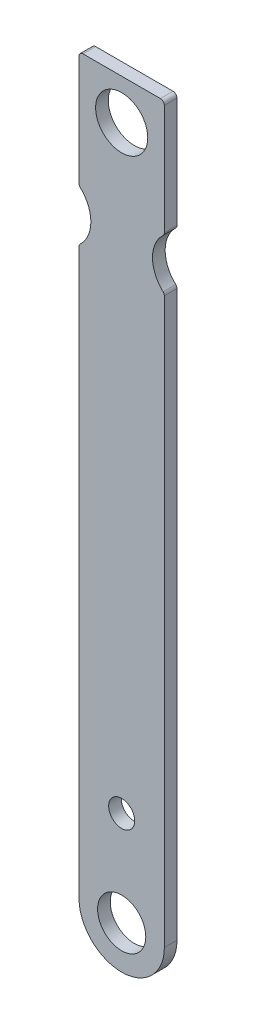
ISO-10303-21;
HEADER;
FILE_DESCRIPTION(('STEP AP214'),'2;1');
FILE_NAME('part.step','',(''),(''),'','','');
FILE_SCHEMA(('AUTOMOTIVE_DESIGN { 1 0 10303 214 1 1 1 1 }'));
ENDSEC;
DATA;
#1=APPLICATION_CONTEXT('core data for automotive mechanical design processes');
#2=APPLICATION_PROTOCOL_DEFINITION('international standard','automotive_design',2000,#1);
#3=PRODUCT_CONTEXT('',#1,'mechanical');
#4=PRODUCT('Part','Part','',(#3));
#5=PRODUCT_RELATED_PRODUCT_CATEGORY('part','',(#4));
#6=PRODUCT_DEFINITION_FORMATION('','',#4);
#7=PRODUCT_DEFINITION_CONTEXT('part definition',#1,'design');
#8=PRODUCT_DEFINITION('design','',#6,#7);
#9=PRODUCT_DEFINITION_SHAPE('','',#8);
#10=(LENGTH_UNIT() NAMED_UNIT(*) SI_UNIT(.MILLI.,.METRE.));
#11=(NAMED_UNIT(*) PLANE_ANGLE_UNIT() SI_UNIT($,.RADIAN.));
#12=(NAMED_UNIT(*) SI_UNIT($,.STERADIAN.) SOLID_ANGLE_UNIT());
#13=UNCERTAINTY_MEASURE_WITH_UNIT(LENGTH_MEASURE(1.E-05),#10,'distance_accuracy_value','');
#14=(GEOMETRIC_REPRESENTATION_CONTEXT(3) GLOBAL_UNCERTAINTY_ASSIGNED_CONTEXT((#13)) GLOBAL_UNIT_ASSIGNED_CONTEXT((#10,
#11,#12)) REPRESENTATION_CONTEXT('',''));
#15=CARTESIAN_POINT('',(0.,0.,0.));
#16=DIRECTION('',(0.,0.,1.));
#17=DIRECTION('',(1.,0.,0.));
#18=AXIS2_PLACEMENT_3D('',#15,#16,#17);
#19=CARTESIAN_POINT('',(2.44999999999965,46.1509999999993,0.8));
#20=DIRECTION('',(0.,0.,1.));
#21=DIRECTION('',(1.,0.,0.));
#22=AXIS2_PLACEMENT_3D('',#19,#20,#21);
#23=PLANE('',#22);
#24=CARTESIAN_POINT('',(0.,6.,0.8));
#25=DIRECTION('',(0.,0.,1.));
#26=DIRECTION('',(1.,0.,0.));
#27=AXIS2_PLACEMENT_3D('',#24,#25,#26);
#28=CIRCLE('',#27,0.825);
#29=CARTESIAN_POINT('',(0.824999999999999,6.,0.8));
#30=VERTEX_POINT('',#29);
#31=EDGE_CURVE('E312',#30,#30,#28,.T.);
#32=ORIENTED_EDGE('',*,*,#31,.F.);
#33=EDGE_LOOP('',(#32));
#34=FACE_BOUND('',#33,.T.);
#35=CARTESIAN_POINT('',(2.44999999999965,46.1509999999993,0.8));
#36=DIRECTION('',(0.,0.,1.));
#37=DIRECTION('',(1.,0.,0.));
#38=AXIS2_PLACEMENT_3D('',#35,#36,#37);
#39=CIRCLE('',#38,0.25);
#40=CARTESIAN_POINT('',(2.69999999999965,46.1509999999993,0.8));
#41=VERTEX_POINT('',#40);
#42=CARTESIAN_POINT('',(2.44999999999965,46.4009999999993,0.8));
#43=VERTEX_POINT('',#42);
#44=EDGE_CURVE('E193',#41,#43,#39,.T.);
#45=ORIENTED_EDGE('',*,*,#44,.T.);
#46=DIRECTION('',(-1.,0.,0.));
#47=VECTOR('',#46,1.);
#48=CARTESIAN_POINT('',(2.44999999999965,46.4009999999993,0.8));
#49=LINE('',#48,#47);
#50=CARTESIAN_POINT('',(-2.44999999999966,46.4009999999993,0.8));
#51=VERTEX_POINT('',#50);
#52=EDGE_CURVE('E111',#43,#51,#49,.T.);
#53=ORIENTED_EDGE('',*,*,#52,.T.);
#54=CARTESIAN_POINT('',(-2.44999999999966,46.1509999999993,0.8));
#55=DIRECTION('',(0.,0.,1.));
#56=DIRECTION('',(1.,0.,0.));
#57=AXIS2_PLACEMENT_3D('',#54,#55,#56);
#58=CIRCLE('',#57,0.25);
#59=CARTESIAN_POINT('',(-2.69999999999966,46.1509999999993,0.8));
#60=VERTEX_POINT('',#59);
#61=EDGE_CURVE('E226',#51,#60,#58,.T.);
#62=ORIENTED_EDGE('',*,*,#61,.T.);
#63=DIRECTION('',(0.,-1.,0.));
#64=VECTOR('',#63,1.);
#65=CARTESIAN_POINT('',(-2.69999999999966,46.1509999999993,0.8));
#66=LINE('',#65,#64);
#67=CARTESIAN_POINT('',(-2.69999999999966,39.1692811006002,0.8));
#68=VERTEX_POINT('',#67);
#69=EDGE_CURVE('E245',#60,#68,#66,.T.);
#70=ORIENTED_EDGE('',*,*,#69,.T.);
#71=CARTESIAN_POINT('',(-2.44999999999966,39.1692811006002,0.8));
#72=DIRECTION('',(0.,0.,1.));
#73=DIRECTION('',(1.,0.,0.));
#74=AXIS2_PLACEMENT_3D('',#71,#72,#73);
#75=CIRCLE('',#74,0.249999999999999);
#76=CARTESIAN_POINT('',(-2.62068527919258,38.9866160096089,0.8));
#77=VERTEX_POINT('',#76);
#78=EDGE_CURVE('E242',#68,#77,#75,.T.);
#79=ORIENTED_EDGE('',*,*,#78,.T.);
#80=CARTESIAN_POINT('',(-4.06400000015107,37.4420000000767,0.8));
#81=DIRECTION('',(0.,0.,-1.));
#82=DIRECTION('',(1.,0.,0.));
#83=AXIS2_PLACEMENT_3D('',#80,#81,#82);
#84=CIRCLE('',#83,2.11400000015105);
#85=CARTESIAN_POINT('',(-2.62068527919257,35.8973839905446,0.8));
#86=VERTEX_POINT('',#85);
#87=EDGE_CURVE('E244',#77,#86,#84,.T.);
#88=ORIENTED_EDGE('',*,*,#87,.T.);
#89=CARTESIAN_POINT('',(-2.44999999999965,35.7147188995533,0.8));
#90=DIRECTION('',(0.,0.,1.));
#91=DIRECTION('',(1.,0.,0.));
#92=AXIS2_PLACEMENT_3D('',#89,#90,#91);
#93=CIRCLE('',#92,0.250000000000003);
#94=CARTESIAN_POINT('',(-2.69999999999965,35.7147188995533,0.8));
#95=VERTEX_POINT('',#94);
#96=EDGE_CURVE('E247',#86,#95,#93,.T.);
#97=ORIENTED_EDGE('',*,*,#96,.T.);
#98=DIRECTION('',(0.,-1.,0.));
#99=VECTOR('',#98,1.);
#100=CARTESIAN_POINT('',(-2.69999999999965,35.7147188995533,0.8));
#101=LINE('',#100,#99);
#102=CARTESIAN_POINT('',(-2.69999999999966,0.,0.8));
#103=VERTEX_POINT('',#102);
#104=EDGE_CURVE('E253',#95,#103,#101,.T.);
#105=ORIENTED_EDGE('',*,*,#104,.T.);
#106=CARTESIAN_POINT('',(0.,0.,0.8));
#107=DIRECTION('',(0.,0.,1.));
#108=DIRECTION('',(1.,0.,0.));
#109=AXIS2_PLACEMENT_3D('',#106,#107,#108);
#110=CIRCLE('',#109,2.69999999999966);
#111=CARTESIAN_POINT('',(2.69999999999966,0.,0.8));
#112=VERTEX_POINT('',#111);
#113=EDGE_CURVE('E255',#103,#112,#110,.T.);
#114=ORIENTED_EDGE('',*,*,#113,.T.);
#115=DIRECTION('',(0.,1.,0.));
#116=VECTOR('',#115,1.);
#117=CARTESIAN_POINT('',(2.69999999999966,0.,0.8));
#118=LINE('',#117,#116);
#119=CARTESIAN_POINT('',(2.69999999999965,35.7147188995533,0.8));
#120=VERTEX_POINT('',#119);
#121=EDGE_CURVE('E257',#112,#120,#118,.T.);
#122=ORIENTED_EDGE('',*,*,#121,.T.);
#123=CARTESIAN_POINT('',(2.44999999999964,35.7147188995533,0.8));
#124=DIRECTION('',(0.,0.,1.));
#125=DIRECTION('',(1.,0.,0.));
#126=AXIS2_PLACEMENT_3D('',#123,#124,#125);
#127=CIRCLE('',#126,0.250000000000009);
#128=CARTESIAN_POINT('',(2.62068527919256,35.8973839905446,0.8));
#129=VERTEX_POINT('',#128);
#130=EDGE_CURVE('E148',#120,#129,#127,.T.);
#131=ORIENTED_EDGE('',*,*,#130,.T.);
#132=CARTESIAN_POINT('',(4.06400000015106,37.4420000000767,0.8));
#133=DIRECTION('',(0.,0.,-1.));
#134=DIRECTION('',(1.,0.,0.));
#135=AXIS2_PLACEMENT_3D('',#132,#133,#134);
#136=CIRCLE('',#135,2.11400000015105);
#137=CARTESIAN_POINT('',(2.62068527919257,38.9866160096089,0.8));
#138=VERTEX_POINT('',#137);
#139=EDGE_CURVE('E142',#129,#138,#136,.T.);
#140=ORIENTED_EDGE('',*,*,#139,.T.);
#141=CARTESIAN_POINT('',(2.44999999999965,39.1692811006002,0.8));
#142=DIRECTION('',(0.,0.,1.));
#143=DIRECTION('',(1.,0.,0.));
#144=AXIS2_PLACEMENT_3D('',#141,#142,#143);
#145=CIRCLE('',#144,0.249999999999998);
#146=CARTESIAN_POINT('',(2.69999999999965,39.1692811006002,0.8));
#147=VERTEX_POINT('',#146);
#148=EDGE_CURVE('E146',#138,#147,#145,.T.);
#149=ORIENTED_EDGE('',*,*,#148,.T.);
#150=DIRECTION('',(0.,1.,0.));
#151=VECTOR('',#150,1.);
#152=CARTESIAN_POINT('',(2.69999999999965,39.1692811006002,0.8));
#153=LINE('',#152,#151);
#154=EDGE_CURVE('E50',#147,#41,#153,.T.);
#155=ORIENTED_EDGE('',*,*,#154,.T.);
#156=EDGE_LOOP('',(#45,#53,#62,#70,#79,#88,#97,#105,#114,#122,#131,#140,#149,#155));
#157=FACE_BOUND('',#156,.T.);
#158=CARTESIAN_POINT('',(0.,0.,0.8));
#159=DIRECTION('',(0.,0.,1.));
#160=DIRECTION('',(1.,0.,0.));
#161=AXIS2_PLACEMENT_3D('',#158,#159,#160);
#162=CIRCLE('',#161,1.525);
#163=CARTESIAN_POINT('',(1.525,0.,0.8));
#164=VERTEX_POINT('',#163);
#165=EDGE_CURVE('E170',#164,#164,#162,.T.);
#166=ORIENTED_EDGE('',*,*,#165,.F.);
#167=EDGE_LOOP('',(#166));
#168=FACE_BOUND('',#167,.T.);
#169=CARTESIAN_POINT('',(0.,43.8509999999993,0.8));
#170=DIRECTION('',(0.,0.,1.));
#171=DIRECTION('',(1.,0.,0.));
#172=AXIS2_PLACEMENT_3D('',#169,#170,#171);
#173=CIRCLE('',#172,1.65);
#174=CARTESIAN_POINT('',(1.65,43.8509999999993,0.8));
#175=VERTEX_POINT('',#174);
#176=EDGE_CURVE('E303',#175,#175,#173,.T.);
#177=ORIENTED_EDGE('',*,*,#176,.F.);
#178=EDGE_LOOP('',(#177));
#179=FACE_BOUND('',#178,.T.);
#180=ADVANCED_FACE('F33',(#34,#157,#168,#179),#23,.T.);
#181=CARTESIAN_POINT('',(2.44999999999965,46.1509999999993,0.));
#182=DIRECTION('',(0.,0.,1.));
#183=DIRECTION('',(1.,0.,0.));
#184=AXIS2_PLACEMENT_3D('',#181,#182,#183);
#185=PLANE('',#184);
#186=CARTESIAN_POINT('',(2.44999999999965,46.1509999999993,0.));
#187=DIRECTION('',(0.,0.,1.));
#188=DIRECTION('',(1.,0.,0.));
#189=AXIS2_PLACEMENT_3D('',#186,#187,#188);
#190=CIRCLE('',#189,0.25);
#191=CARTESIAN_POINT('',(2.69999999999965,46.1509999999993,0.));
#192=VERTEX_POINT('',#191);
#193=CARTESIAN_POINT('',(2.44999999999965,46.4009999999993,0.));
#194=VERTEX_POINT('',#193);
#195=EDGE_CURVE('E166',#192,#194,#190,.T.);
#196=ORIENTED_EDGE('',*,*,#195,.F.);
#197=DIRECTION('',(0.,1.,0.));
#198=VECTOR('',#197,1.);
#199=CARTESIAN_POINT('',(2.69999999999965,39.1692811006002,0.));
#200=LINE('',#199,#198);
#201=CARTESIAN_POINT('',(2.69999999999965,39.1692811006002,0.));
#202=VERTEX_POINT('',#201);
#203=EDGE_CURVE('E103',#202,#192,#200,.T.);
#204=ORIENTED_EDGE('',*,*,#203,.F.);
#205=CARTESIAN_POINT('',(2.44999999999965,39.1692811006002,0.));
#206=DIRECTION('',(0.,0.,1.));
#207=DIRECTION('',(1.,0.,0.));
#208=AXIS2_PLACEMENT_3D('',#205,#206,#207);
#209=CIRCLE('',#208,0.249999999999998);
#210=CARTESIAN_POINT('',(2.62068527919257,38.9866160096089,0.));
#211=VERTEX_POINT('',#210);
#212=EDGE_CURVE('E97',#211,#202,#209,.T.);
#213=ORIENTED_EDGE('',*,*,#212,.F.);
#214=CARTESIAN_POINT('',(4.06400000015106,37.4420000000767,0.));
#215=DIRECTION('',(0.,0.,-1.));
#216=DIRECTION('',(1.,0.,0.));
#217=AXIS2_PLACEMENT_3D('',#214,#215,#216);
#218=CIRCLE('',#217,2.11400000015105);
#219=CARTESIAN_POINT('',(2.62068527919256,35.8973839905446,0.));
#220=VERTEX_POINT('',#219);
#221=EDGE_CURVE('E156',#220,#211,#218,.T.);
#222=ORIENTED_EDGE('',*,*,#221,.F.);
#223=CARTESIAN_POINT('',(2.44999999999964,35.7147188995533,0.));
#224=DIRECTION('',(0.,0.,1.));
#225=DIRECTION('',(1.,0.,0.));
#226=AXIS2_PLACEMENT_3D('',#223,#224,#225);
#227=CIRCLE('',#226,0.250000000000009);
#228=CARTESIAN_POINT('',(2.69999999999965,35.7147188995533,0.));
#229=VERTEX_POINT('',#228);
#230=EDGE_CURVE('E188',#229,#220,#227,.T.);
#231=ORIENTED_EDGE('',*,*,#230,.F.);
#232=DIRECTION('',(0.,1.,0.));
#233=VECTOR('',#232,1.);
#234=CARTESIAN_POINT('',(2.69999999999966,0.,0.));
#235=LINE('',#234,#233);
#236=CARTESIAN_POINT('',(2.69999999999966,0.,0.));
#237=VERTEX_POINT('',#236);
#238=EDGE_CURVE('E186',#237,#229,#235,.T.);
#239=ORIENTED_EDGE('',*,*,#238,.F.);
#240=CARTESIAN_POINT('',(0.,0.,0.));
#241=DIRECTION('',(0.,0.,1.));
#242=DIRECTION('',(1.,0.,0.));
#243=AXIS2_PLACEMENT_3D('',#240,#241,#242);
#244=CIRCLE('',#243,2.69999999999966);
#245=CARTESIAN_POINT('',(-2.69999999999966,0.,0.));
#246=VERTEX_POINT('',#245);
#247=EDGE_CURVE('E184',#246,#237,#244,.T.);
#248=ORIENTED_EDGE('',*,*,#247,.F.);
#249=DIRECTION('',(0.,-1.,0.));
#250=VECTOR('',#249,1.);
#251=CARTESIAN_POINT('',(-2.69999999999965,35.7147188995533,0.));
#252=LINE('',#251,#250);
#253=CARTESIAN_POINT('',(-2.69999999999965,35.7147188995533,0.));
#254=VERTEX_POINT('',#253);
#255=EDGE_CURVE('E182',#254,#246,#252,.T.);
#256=ORIENTED_EDGE('',*,*,#255,.F.);
#257=CARTESIAN_POINT('',(-2.44999999999965,35.7147188995533,0.));
#258=DIRECTION('',(0.,0.,1.));
#259=DIRECTION('',(1.,0.,0.));
#260=AXIS2_PLACEMENT_3D('',#257,#258,#259);
#261=CIRCLE('',#260,0.250000000000003);
#262=CARTESIAN_POINT('',(-2.62068527919257,35.8973839905446,0.));
#263=VERTEX_POINT('',#262);
#264=EDGE_CURVE('E180',#263,#254,#261,.T.);
#265=ORIENTED_EDGE('',*,*,#264,.F.);
#266=CARTESIAN_POINT('',(-4.06400000015107,37.4420000000767,0.));
#267=DIRECTION('',(0.,0.,-1.));
#268=DIRECTION('',(1.,0.,0.));
#269=AXIS2_PLACEMENT_3D('',#266,#267,#268);
#270=CIRCLE('',#269,2.11400000015105);
#271=CARTESIAN_POINT('',(-2.62068527919258,38.9866160096089,0.));
#272=VERTEX_POINT('',#271);
#273=EDGE_CURVE('E178',#272,#263,#270,.T.);
#274=ORIENTED_EDGE('',*,*,#273,.F.);
#275=CARTESIAN_POINT('',(-2.44999999999966,39.1692811006002,0.));
#276=DIRECTION('',(0.,0.,1.));
#277=DIRECTION('',(1.,0.,0.));
#278=AXIS2_PLACEMENT_3D('',#275,#276,#277);
#279=CIRCLE('',#278,0.249999999999999);
#280=CARTESIAN_POINT('',(-2.69999999999966,39.1692811006002,0.));
#281=VERTEX_POINT('',#280);
#282=EDGE_CURVE('E176',#281,#272,#279,.T.);
#283=ORIENTED_EDGE('',*,*,#282,.F.);
#284=DIRECTION('',(0.,-1.,0.));
#285=VECTOR('',#284,1.);
#286=CARTESIAN_POINT('',(-2.69999999999966,46.1509999999993,0.));
#287=LINE('',#286,#285);
#288=CARTESIAN_POINT('',(-2.69999999999966,46.1509999999993,0.));
#289=VERTEX_POINT('',#288);
#290=EDGE_CURVE('E174',#289,#281,#287,.T.);
#291=ORIENTED_EDGE('',*,*,#290,.F.);
#292=CARTESIAN_POINT('',(-2.44999999999966,46.1509999999993,0.));
#293=DIRECTION('',(0.,0.,1.));
#294=DIRECTION('',(1.,0.,0.));
#295=AXIS2_PLACEMENT_3D('',#292,#293,#294);
#296=CIRCLE('',#295,0.25);
#297=CARTESIAN_POINT('',(-2.44999999999966,46.4009999999993,0.));
#298=VERTEX_POINT('',#297);
#299=EDGE_CURVE('E172',#298,#289,#296,.T.);
#300=ORIENTED_EDGE('',*,*,#299,.F.);
#301=DIRECTION('',(-1.,0.,0.));
#302=VECTOR('',#301,1.);
#303=CARTESIAN_POINT('',(2.44999999999965,46.4009999999993,0.));
#304=LINE('',#303,#302);
#305=EDGE_CURVE('E169',#194,#298,#304,.T.);
#306=ORIENTED_EDGE('',*,*,#305,.F.);
#307=EDGE_LOOP('',(#196,#204,#213,#222,#231,#239,#248,#256,#265,#274,#283,#291,#300,#306));
#308=FACE_BOUND('',#307,.T.);
#309=CARTESIAN_POINT('',(0.,0.,0.));
#310=DIRECTION('',(0.,0.,1.));
#311=DIRECTION('',(1.,0.,0.));
#312=AXIS2_PLACEMENT_3D('',#309,#310,#311);
#313=CIRCLE('',#312,1.525);
#314=CARTESIAN_POINT('',(1.525,0.,0.));
#315=VERTEX_POINT('',#314);
#316=EDGE_CURVE('E315',#315,#315,#313,.T.);
#317=ORIENTED_EDGE('',*,*,#316,.T.);
#318=EDGE_LOOP('',(#317));
#319=FACE_BOUND('',#318,.T.);
#320=CARTESIAN_POINT('',(0.,6.,0.));
#321=DIRECTION('',(0.,0.,1.));
#322=DIRECTION('',(1.,0.,0.));
#323=AXIS2_PLACEMENT_3D('',#320,#321,#322);
#324=CIRCLE('',#323,0.825);
#325=CARTESIAN_POINT('',(0.824999999999999,6.,0.));
#326=VERTEX_POINT('',#325);
#327=EDGE_CURVE('E309',#326,#326,#324,.T.);
#328=ORIENTED_EDGE('',*,*,#327,.T.);
#329=EDGE_LOOP('',(#328));
#330=FACE_BOUND('',#329,.T.);
#331=CARTESIAN_POINT('',(0.,43.8509999999993,0.));
#332=DIRECTION('',(0.,0.,1.));
#333=DIRECTION('',(1.,0.,0.));
#334=AXIS2_PLACEMENT_3D('',#331,#332,#333);
#335=CIRCLE('',#334,1.65);
#336=CARTESIAN_POINT('',(1.65,43.8509999999993,0.));
#337=VERTEX_POINT('',#336);
#338=EDGE_CURVE('E306',#337,#337,#335,.T.);
#339=ORIENTED_EDGE('',*,*,#338,.T.);
#340=EDGE_LOOP('',(#339));
#341=FACE_BOUND('',#340,.T.);
#342=ADVANCED_FACE('F230',(#308,#319,#330,#341),#185,.F.);
#343=CARTESIAN_POINT('',(2.44999999999965,46.1509999999993,0.8));
#344=DIRECTION('',(0.,0.,-1.));
#345=DIRECTION('',(-1.,0.,0.));
#346=AXIS2_PLACEMENT_3D('',#343,#344,#345);
#347=CYLINDRICAL_SURFACE('',#346,0.25);
#348=ORIENTED_EDGE('',*,*,#195,.T.);
#349=DIRECTION('',(0.,0.,-1.));
#350=VECTOR('',#349,1.);
#351=CARTESIAN_POINT('',(2.44999999999965,46.4009999999993,0.8));
#352=LINE('',#351,#350);
#353=EDGE_CURVE('E11',#43,#194,#352,.T.);
#354=ORIENTED_EDGE('',*,*,#353,.F.);
#355=ORIENTED_EDGE('',*,*,#44,.F.);
#356=DIRECTION('',(0.,0.,-1.));
#357=VECTOR('',#356,1.);
#358=CARTESIAN_POINT('',(2.69999999999965,46.1509999999993,0.8));
#359=LINE('',#358,#357);
#360=EDGE_CURVE('E162',#41,#192,#359,.T.);
#361=ORIENTED_EDGE('',*,*,#360,.T.);
#362=EDGE_LOOP('',(#348,#354,#355,#361));
#363=FACE_BOUND('',#362,.T.);
#364=ADVANCED_FACE('F35',(#363),#347,.T.);
#365=CARTESIAN_POINT('',(2.44999999999965,46.4009999999993,0.8));
#366=DIRECTION('',(0.,-1.,0.));
#367=DIRECTION('',(0.,0.,-1.));
#368=AXIS2_PLACEMENT_3D('',#365,#366,#367);
#369=PLANE('',#368);
#370=ORIENTED_EDGE('',*,*,#305,.T.);
#371=DIRECTION('',(0.,0.,-1.));
#372=VECTOR('',#371,1.);
#373=CARTESIAN_POINT('',(-2.44999999999966,46.4009999999993,0.8));
#374=LINE('',#373,#372);
#375=EDGE_CURVE('E42',#51,#298,#374,.T.);
#376=ORIENTED_EDGE('',*,*,#375,.F.);
#377=ORIENTED_EDGE('',*,*,#52,.F.);
#378=ORIENTED_EDGE('',*,*,#353,.T.);
#379=EDGE_LOOP('',(#370,#376,#377,#378));
#380=FACE_BOUND('',#379,.T.);
#381=ADVANCED_FACE('F437',(#380),#369,.F.);
#382=CARTESIAN_POINT('',(-2.44999999999966,46.1509999999993,0.8));
#383=DIRECTION('',(0.,0.,-1.));
#384=DIRECTION('',(-1.,0.,0.));
#385=AXIS2_PLACEMENT_3D('',#382,#383,#384);
#386=CYLINDRICAL_SURFACE('',#385,0.25);
#387=ORIENTED_EDGE('',*,*,#299,.T.);
#388=DIRECTION('',(0.,0.,-1.));
#389=VECTOR('',#388,1.);
#390=CARTESIAN_POINT('',(-2.69999999999966,46.1509999999993,0.8));
#391=LINE('',#390,#389);
#392=EDGE_CURVE('E218',#60,#289,#391,.T.);
#393=ORIENTED_EDGE('',*,*,#392,.F.);
#394=ORIENTED_EDGE('',*,*,#61,.F.);
#395=ORIENTED_EDGE('',*,*,#375,.T.);
#396=EDGE_LOOP('',(#387,#393,#394,#395));
#397=FACE_BOUND('',#396,.T.);
#398=ADVANCED_FACE('F224',(#397),#386,.T.);
#399=CARTESIAN_POINT('',(-2.69999999999966,46.1509999999993,0.8));
#400=DIRECTION('',(1.,0.,0.));
#401=DIRECTION('',(0.,0.,-1.));
#402=AXIS2_PLACEMENT_3D('',#399,#400,#401);
#403=PLANE('',#402);
#404=ORIENTED_EDGE('',*,*,#290,.T.);
#405=DIRECTION('',(0.,0.,-1.));
#406=VECTOR('',#405,1.);
#407=CARTESIAN_POINT('',(-2.69999999999966,39.1692811006002,0.8));
#408=LINE('',#407,#406);
#409=EDGE_CURVE('E215',#68,#281,#408,.T.);
#410=ORIENTED_EDGE('',*,*,#409,.F.);
#411=ORIENTED_EDGE('',*,*,#69,.F.);
#412=ORIENTED_EDGE('',*,*,#392,.T.);
#413=EDGE_LOOP('',(#404,#410,#411,#412));
#414=FACE_BOUND('',#413,.T.);
#415=ADVANCED_FACE('F236',(#414),#403,.F.);
#416=CARTESIAN_POINT('',(-2.44999999999966,39.1692811006002,0.8));
#417=DIRECTION('',(0.,0.,-1.));
#418=DIRECTION('',(-1.,0.,0.));
#419=AXIS2_PLACEMENT_3D('',#416,#417,#418);
#420=CYLINDRICAL_SURFACE('',#419,0.249999999999999);
#421=ORIENTED_EDGE('',*,*,#282,.T.);
#422=DIRECTION('',(0.,0.,-1.));
#423=VECTOR('',#422,1.);
#424=CARTESIAN_POINT('',(-2.62068527919258,38.9866160096089,0.8));
#425=LINE('',#424,#423);
#426=EDGE_CURVE('E212',#77,#272,#425,.T.);
#427=ORIENTED_EDGE('',*,*,#426,.F.);
#428=ORIENTED_EDGE('',*,*,#78,.F.);
#429=ORIENTED_EDGE('',*,*,#409,.T.);
#430=EDGE_LOOP('',(#421,#427,#428,#429));
#431=FACE_BOUND('',#430,.T.);
#432=ADVANCED_FACE('F240',(#431),#420,.T.);
#433=CARTESIAN_POINT('',(-4.06400000015107,37.4420000000767,0.8));
#434=DIRECTION('',(0.,0.,-1.));
#435=DIRECTION('',(-1.,0.,0.));
#436=AXIS2_PLACEMENT_3D('',#433,#434,#435);
#437=CYLINDRICAL_SURFACE('',#436,2.11400000015105);
#438=ORIENTED_EDGE('',*,*,#273,.T.);
#439=DIRECTION('',(0.,0.,-1.));
#440=VECTOR('',#439,1.);
#441=CARTESIAN_POINT('',(-2.62068527919257,35.8973839905446,0.8));
#442=LINE('',#441,#440);
#443=EDGE_CURVE('E209',#86,#263,#442,.T.);
#444=ORIENTED_EDGE('',*,*,#443,.F.);
#445=ORIENTED_EDGE('',*,*,#87,.F.);
#446=ORIENTED_EDGE('',*,*,#426,.T.);
#447=EDGE_LOOP('',(#438,#444,#445,#446));
#448=FACE_BOUND('',#447,.T.);
#449=ADVANCED_FACE('F402',(#448),#437,.F.);
#450=CARTESIAN_POINT('',(-2.44999999999965,35.7147188995533,0.8));
#451=DIRECTION('',(0.,0.,-1.));
#452=DIRECTION('',(-1.,0.,0.));
#453=AXIS2_PLACEMENT_3D('',#450,#451,#452);
#454=CYLINDRICAL_SURFACE('',#453,0.250000000000003);
#455=ORIENTED_EDGE('',*,*,#264,.T.);
#456=DIRECTION('',(0.,0.,-1.));
#457=VECTOR('',#456,1.);
#458=CARTESIAN_POINT('',(-2.69999999999965,35.7147188995533,0.8));
#459=LINE('',#458,#457);
#460=EDGE_CURVE('E206',#95,#254,#459,.T.);
#461=ORIENTED_EDGE('',*,*,#460,.F.);
#462=ORIENTED_EDGE('',*,*,#96,.F.);
#463=ORIENTED_EDGE('',*,*,#443,.T.);
#464=EDGE_LOOP('',(#455,#461,#462,#463));
#465=FACE_BOUND('',#464,.T.);
#466=ADVANCED_FACE('F392',(#465),#454,.T.);
#467=CARTESIAN_POINT('',(-2.69999999999965,35.7147188995533,0.8));
#468=DIRECTION('',(1.,0.,0.));
#469=DIRECTION('',(0.,1.,0.));
#470=AXIS2_PLACEMENT_3D('',#467,#468,#469);
#471=PLANE('',#470);
#472=ORIENTED_EDGE('',*,*,#255,.T.);
#473=DIRECTION('',(0.,0.,-1.));
#474=VECTOR('',#473,1.);
#475=CARTESIAN_POINT('',(-2.69999999999966,0.,0.8));
#476=LINE('',#475,#474);
#477=EDGE_CURVE('E203',#103,#246,#476,.T.);
#478=ORIENTED_EDGE('',*,*,#477,.F.);
#479=ORIENTED_EDGE('',*,*,#104,.F.);
#480=ORIENTED_EDGE('',*,*,#460,.T.);
#481=EDGE_LOOP('',(#472,#478,#479,#480));
#482=FACE_BOUND('',#481,.T.);
#483=ADVANCED_FACE('F382',(#482),#471,.F.);
#484=CARTESIAN_POINT('',(0.,0.,0.8));
#485=DIRECTION('',(0.,0.,-1.));
#486=DIRECTION('',(-1.,0.,0.));
#487=AXIS2_PLACEMENT_3D('',#484,#485,#486);
#488=CYLINDRICAL_SURFACE('',#487,2.69999999999966);
#489=ORIENTED_EDGE('',*,*,#247,.T.);
#490=DIRECTION('',(0.,0.,-1.));
#491=VECTOR('',#490,1.);
#492=CARTESIAN_POINT('',(2.69999999999966,0.,0.8));
#493=LINE('',#492,#491);
#494=EDGE_CURVE('E200',#112,#237,#493,.T.);
#495=ORIENTED_EDGE('',*,*,#494,.F.);
#496=ORIENTED_EDGE('',*,*,#113,.F.);
#497=ORIENTED_EDGE('',*,*,#477,.T.);
#498=EDGE_LOOP('',(#489,#495,#496,#497));
#499=FACE_BOUND('',#498,.T.);
#500=ADVANCED_FACE('F373',(#499),#488,.T.);
#501=CARTESIAN_POINT('',(2.69999999999966,0.,0.8));
#502=DIRECTION('',(-1.,0.,0.));
#503=DIRECTION('',(0.,-1.,0.));
#504=AXIS2_PLACEMENT_3D('',#501,#502,#503);
#505=PLANE('',#504);
#506=ORIENTED_EDGE('',*,*,#238,.T.);
#507=DIRECTION('',(0.,0.,-1.));
#508=VECTOR('',#507,1.);
#509=CARTESIAN_POINT('',(2.69999999999965,35.7147188995533,0.8));
#510=LINE('',#509,#508);
#511=EDGE_CURVE('E197',#120,#229,#510,.T.);
#512=ORIENTED_EDGE('',*,*,#511,.F.);
#513=ORIENTED_EDGE('',*,*,#121,.F.);
#514=ORIENTED_EDGE('',*,*,#494,.T.);
#515=EDGE_LOOP('',(#506,#512,#513,#514));
#516=FACE_BOUND('',#515,.T.);
#517=ADVANCED_FACE('F263',(#516),#505,.F.);
#518=CARTESIAN_POINT('',(2.44999999999964,35.7147188995533,0.8));
#519=DIRECTION('',(0.,0.,-1.));
#520=DIRECTION('',(-1.,0.,0.));
#521=AXIS2_PLACEMENT_3D('',#518,#519,#520);
#522=CYLINDRICAL_SURFACE('',#521,0.250000000000009);
#523=ORIENTED_EDGE('',*,*,#230,.T.);
#524=DIRECTION('',(0.,0.,-1.));
#525=VECTOR('',#524,1.);
#526=CARTESIAN_POINT('',(2.62068527919256,35.8973839905446,0.8));
#527=LINE('',#526,#525);
#528=EDGE_CURVE('E157',#129,#220,#527,.T.);
#529=ORIENTED_EDGE('',*,*,#528,.F.);
#530=ORIENTED_EDGE('',*,*,#130,.F.);
#531=ORIENTED_EDGE('',*,*,#511,.T.);
#532=EDGE_LOOP('',(#523,#529,#530,#531));
#533=FACE_BOUND('',#532,.T.);
#534=ADVANCED_FACE('F267',(#533),#522,.T.);
#535=CARTESIAN_POINT('',(4.06400000015106,37.4420000000767,0.8));
#536=DIRECTION('',(0.,0.,-1.));
#537=DIRECTION('',(-1.,0.,0.));
#538=AXIS2_PLACEMENT_3D('',#535,#536,#537);
#539=CYLINDRICAL_SURFACE('',#538,2.11400000015105);
#540=ORIENTED_EDGE('',*,*,#221,.T.);
#541=DIRECTION('',(0.,0.,-1.));
#542=VECTOR('',#541,1.);
#543=CARTESIAN_POINT('',(2.62068527919257,38.9866160096089,0.8));
#544=LINE('',#543,#542);
#545=EDGE_CURVE('E153',#138,#211,#544,.T.);
#546=ORIENTED_EDGE('',*,*,#545,.F.);
#547=ORIENTED_EDGE('',*,*,#139,.F.);
#548=ORIENTED_EDGE('',*,*,#528,.T.);
#549=EDGE_LOOP('',(#540,#546,#547,#548));
#550=FACE_BOUND('',#549,.T.);
#551=ADVANCED_FACE('F154',(#550),#539,.F.);
#552=CARTESIAN_POINT('',(2.44999999999965,39.1692811006002,0.8));
#553=DIRECTION('',(0.,0.,-1.));
#554=DIRECTION('',(-1.,0.,0.));
#555=AXIS2_PLACEMENT_3D('',#552,#553,#554);
#556=CYLINDRICAL_SURFACE('',#555,0.249999999999998);
#557=ORIENTED_EDGE('',*,*,#212,.T.);
#558=DIRECTION('',(0.,0.,-1.));
#559=VECTOR('',#558,1.);
#560=CARTESIAN_POINT('',(2.69999999999965,39.1692811006002,0.8));
#561=LINE('',#560,#559);
#562=EDGE_CURVE('E158',#147,#202,#561,.T.);
#563=ORIENTED_EDGE('',*,*,#562,.F.);
#564=ORIENTED_EDGE('',*,*,#148,.F.);
#565=ORIENTED_EDGE('',*,*,#545,.T.);
#566=EDGE_LOOP('',(#557,#563,#564,#565));
#567=FACE_BOUND('',#566,.T.);
#568=ADVANCED_FACE('F160',(#567),#556,.T.);
#569=CARTESIAN_POINT('',(2.69999999999965,39.1692811006002,0.8));
#570=DIRECTION('',(-1.,0.,0.));
#571=DIRECTION('',(0.,-1.,0.));
#572=AXIS2_PLACEMENT_3D('',#569,#570,#571);
#573=PLANE('',#572);
#574=ORIENTED_EDGE('',*,*,#203,.T.);
#575=ORIENTED_EDGE('',*,*,#360,.F.);
#576=ORIENTED_EDGE('',*,*,#154,.F.);
#577=ORIENTED_EDGE('',*,*,#562,.T.);
#578=EDGE_LOOP('',(#574,#575,#576,#577));
#579=FACE_BOUND('',#578,.T.);
#580=ADVANCED_FACE('F271',(#579),#573,.F.);
#581=CARTESIAN_POINT('',(0.,0.,0.8));
#582=DIRECTION('',(0.,0.,-1.));
#583=DIRECTION('',(-1.,0.,0.));
#584=AXIS2_PLACEMENT_3D('',#581,#582,#583);
#585=CYLINDRICAL_SURFACE('',#584,1.525);
#586=ORIENTED_EDGE('',*,*,#165,.T.);
#587=EDGE_LOOP('',(#586));
#588=FACE_BOUND('',#587,.T.);
#589=ORIENTED_EDGE('',*,*,#316,.F.);
#590=EDGE_LOOP('',(#589));
#591=FACE_BOUND('',#590,.T.);
#592=ADVANCED_FACE('F273',(#588,#591),#585,.F.);
#593=CARTESIAN_POINT('',(0.,6.,0.8));
#594=DIRECTION('',(0.,0.,-1.));
#595=DIRECTION('',(-1.,0.,0.));
#596=AXIS2_PLACEMENT_3D('',#593,#594,#595);
#597=CYLINDRICAL_SURFACE('',#596,0.825);
#598=ORIENTED_EDGE('',*,*,#31,.T.);
#599=EDGE_LOOP('',(#598));
#600=FACE_BOUND('',#599,.T.);
#601=ORIENTED_EDGE('',*,*,#327,.F.);
#602=EDGE_LOOP('',(#601));
#603=FACE_BOUND('',#602,.T.);
#604=ADVANCED_FACE('F279',(#600,#603),#597,.F.);
#605=CARTESIAN_POINT('',(0.,43.8509999999993,0.8));
#606=DIRECTION('',(0.,0.,-1.));
#607=DIRECTION('',(-1.,0.,0.));
#608=AXIS2_PLACEMENT_3D('',#605,#606,#607);
#609=CYLINDRICAL_SURFACE('',#608,1.65);
#610=ORIENTED_EDGE('',*,*,#176,.T.);
#611=EDGE_LOOP('',(#610));
#612=FACE_BOUND('',#611,.T.);
#613=ORIENTED_EDGE('',*,*,#338,.F.);
#614=EDGE_LOOP('',(#613));
#615=FACE_BOUND('',#614,.T.);
#616=ADVANCED_FACE('F294',(#612,#615),#609,.F.);
#617=CLOSED_SHELL('',(#180,#342,#364,#381,#398,#415,#432,#449,#466,#483,#500,#517,#534,#551,
#568,#580,#592,#604,#616));
#618=MANIFOLD_SOLID_BREP('B2',#617);
#619=ADVANCED_BREP_SHAPE_REPRESENTATION('',(#18,#618),#14);
#620=SHAPE_DEFINITION_REPRESENTATION(#9,#619);
ENDSEC;
END-ISO-10303-21;
